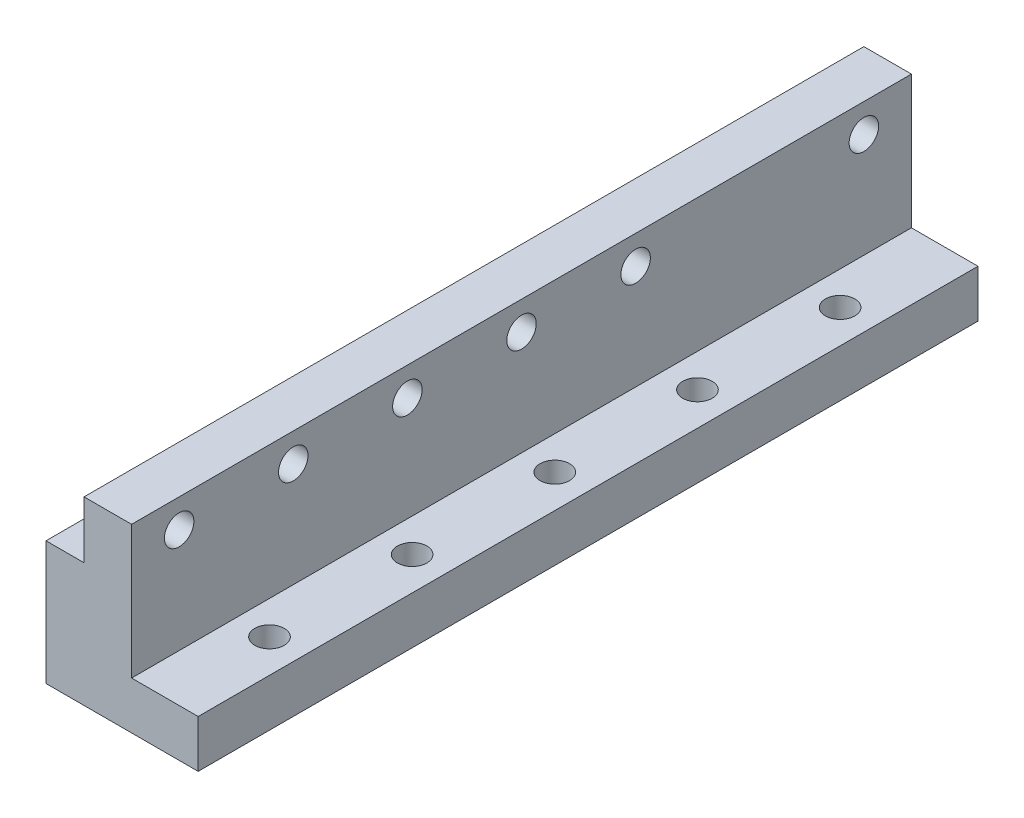
ISO-10303-21;
HEADER;
FILE_DESCRIPTION(('STEP AP214'),'2;1');
FILE_NAME('part.step','',(''),(''),'','','');
FILE_SCHEMA(('AUTOMOTIVE_DESIGN { 1 0 10303 214 1 1 1 1 }'));
ENDSEC;
DATA;
#1=APPLICATION_CONTEXT('core data for automotive mechanical design processes');
#2=APPLICATION_PROTOCOL_DEFINITION('international standard','automotive_design',2000,#1);
#3=PRODUCT_CONTEXT('',#1,'mechanical');
#4=PRODUCT('Part','Part','',(#3));
#5=PRODUCT_RELATED_PRODUCT_CATEGORY('part','',(#4));
#6=PRODUCT_DEFINITION_FORMATION('','',#4);
#7=PRODUCT_DEFINITION_CONTEXT('part definition',#1,'design');
#8=PRODUCT_DEFINITION('design','',#6,#7);
#9=PRODUCT_DEFINITION_SHAPE('','',#8);
#10=(LENGTH_UNIT() NAMED_UNIT(*) SI_UNIT(.MILLI.,.METRE.));
#11=(NAMED_UNIT(*) PLANE_ANGLE_UNIT() SI_UNIT($,.RADIAN.));
#12=(NAMED_UNIT(*) SI_UNIT($,.STERADIAN.) SOLID_ANGLE_UNIT());
#13=UNCERTAINTY_MEASURE_WITH_UNIT(LENGTH_MEASURE(1.E-05),#10,'distance_accuracy_value','');
#14=(GEOMETRIC_REPRESENTATION_CONTEXT(3) GLOBAL_UNCERTAINTY_ASSIGNED_CONTEXT((#13)) GLOBAL_UNIT_ASSIGNED_CONTEXT((#10,
#11,#12)) REPRESENTATION_CONTEXT('',''));
#15=CARTESIAN_POINT('',(0.,0.,0.));
#16=DIRECTION('',(0.,0.,1.));
#17=DIRECTION('',(1.,0.,0.));
#18=AXIS2_PLACEMENT_3D('',#15,#16,#17);
#19=CARTESIAN_POINT('',(12.5,-13.,11.));
#20=DIRECTION('',(0.,1.,0.));
#21=DIRECTION('',(0.,0.,1.));
#22=AXIS2_PLACEMENT_3D('',#19,#20,#21);
#23=CYLINDRICAL_SURFACE('',#22,1.54999999999999);
#24=CARTESIAN_POINT('',(12.5,-13.,11.));
#25=DIRECTION('',(0.,1.,0.));
#26=DIRECTION('',(0.,0.,-1.));
#27=AXIS2_PLACEMENT_3D('',#24,#25,#26);
#28=CIRCLE('',#27,1.54999999999999);
#29=CARTESIAN_POINT('',(12.5,-13.,9.45000000000002));
#30=VERTEX_POINT('',#29);
#31=EDGE_CURVE('E44',#30,#30,#28,.T.);
#32=ORIENTED_EDGE('',*,*,#31,.F.);
#33=EDGE_LOOP('',(#32));
#34=FACE_BOUND('',#33,.T.);
#35=CARTESIAN_POINT('',(12.5,-8.,11.));
#36=DIRECTION('',(0.,1.,0.));
#37=DIRECTION('',(0.,0.,-1.));
#38=AXIS2_PLACEMENT_3D('',#35,#36,#37);
#39=CIRCLE('',#38,1.54999999999999);
#40=CARTESIAN_POINT('',(12.5,-8.,9.45000000000002));
#41=VERTEX_POINT('',#40);
#42=EDGE_CURVE('E11',#41,#41,#39,.T.);
#43=ORIENTED_EDGE('',*,*,#42,.T.);
#44=EDGE_LOOP('',(#43));
#45=FACE_BOUND('',#44,.T.);
#46=ADVANCED_FACE('F36',(#34,#45),#23,.F.);
#47=CARTESIAN_POINT('',(12.5,-13.,26.));
#48=DIRECTION('',(0.,1.,0.));
#49=DIRECTION('',(0.,0.,1.));
#50=AXIS2_PLACEMENT_3D('',#47,#48,#49);
#51=CYLINDRICAL_SURFACE('',#50,1.54999999999999);
#52=CARTESIAN_POINT('',(12.5,-13.,26.));
#53=DIRECTION('',(0.,1.,0.));
#54=DIRECTION('',(0.,0.,-1.));
#55=AXIS2_PLACEMENT_3D('',#52,#53,#54);
#56=CIRCLE('',#55,1.54999999999999);
#57=CARTESIAN_POINT('',(12.5,-13.,24.45));
#58=VERTEX_POINT('',#57);
#59=EDGE_CURVE('E190',#58,#58,#56,.T.);
#60=ORIENTED_EDGE('',*,*,#59,.F.);
#61=EDGE_LOOP('',(#60));
#62=FACE_BOUND('',#61,.T.);
#63=CARTESIAN_POINT('',(12.5,-8.,26.));
#64=DIRECTION('',(0.,1.,0.));
#65=DIRECTION('',(0.,0.,-1.));
#66=AXIS2_PLACEMENT_3D('',#63,#64,#65);
#67=CIRCLE('',#66,1.54999999999999);
#68=CARTESIAN_POINT('',(12.5,-8.,24.45));
#69=VERTEX_POINT('',#68);
#70=EDGE_CURVE('E193',#69,#69,#67,.T.);
#71=ORIENTED_EDGE('',*,*,#70,.T.);
#72=EDGE_LOOP('',(#71));
#73=FACE_BOUND('',#72,.T.);
#74=ADVANCED_FACE('F202',(#62,#73),#51,.F.);
#75=CARTESIAN_POINT('',(12.5,-13.,41.));
#76=DIRECTION('',(0.,1.,0.));
#77=DIRECTION('',(0.,0.,1.));
#78=AXIS2_PLACEMENT_3D('',#75,#76,#77);
#79=CYLINDRICAL_SURFACE('',#78,1.54999999999999);
#80=CARTESIAN_POINT('',(12.5,-13.,41.));
#81=DIRECTION('',(0.,1.,0.));
#82=DIRECTION('',(0.,0.,-1.));
#83=AXIS2_PLACEMENT_3D('',#80,#81,#82);
#84=CIRCLE('',#83,1.54999999999999);
#85=CARTESIAN_POINT('',(12.5,-13.,39.45));
#86=VERTEX_POINT('',#85);
#87=EDGE_CURVE('E164',#86,#86,#84,.T.);
#88=ORIENTED_EDGE('',*,*,#87,.F.);
#89=EDGE_LOOP('',(#88));
#90=FACE_BOUND('',#89,.T.);
#91=CARTESIAN_POINT('',(12.5,-8.,41.));
#92=DIRECTION('',(0.,1.,0.));
#93=DIRECTION('',(0.,0.,-1.));
#94=AXIS2_PLACEMENT_3D('',#91,#92,#93);
#95=CIRCLE('',#94,1.54999999999999);
#96=CARTESIAN_POINT('',(12.5,-8.,39.45));
#97=VERTEX_POINT('',#96);
#98=EDGE_CURVE('E187',#97,#97,#95,.T.);
#99=ORIENTED_EDGE('',*,*,#98,.T.);
#100=EDGE_LOOP('',(#99));
#101=FACE_BOUND('',#100,.T.);
#102=ADVANCED_FACE('F238',(#90,#101),#79,.F.);
#103=CARTESIAN_POINT('',(9.,6.,82.));
#104=DIRECTION('',(0.,-1.,0.));
#105=DIRECTION('',(1.,0.,0.));
#106=AXIS2_PLACEMENT_3D('',#103,#104,#105);
#107=PLANE('',#106);
#108=DIRECTION('',(-1.,0.,0.));
#109=VECTOR('',#108,1.);
#110=CARTESIAN_POINT('',(9.,6.,0.));
#111=LINE('',#110,#109);
#112=CARTESIAN_POINT('',(9.,6.,0.));
#113=VERTEX_POINT('',#112);
#114=CARTESIAN_POINT('',(4.,6.,0.));
#115=VERTEX_POINT('',#114);
#116=EDGE_CURVE('E134',#113,#115,#111,.T.);
#117=ORIENTED_EDGE('',*,*,#116,.T.);
#118=DIRECTION('',(0.,0.,-1.));
#119=VECTOR('',#118,1.);
#120=CARTESIAN_POINT('',(4.,6.,82.));
#121=LINE('',#120,#119);
#122=CARTESIAN_POINT('',(4.,6.,82.));
#123=VERTEX_POINT('',#122);
#124=EDGE_CURVE('E162',#123,#115,#121,.T.);
#125=ORIENTED_EDGE('',*,*,#124,.F.);
#126=DIRECTION('',(-1.,0.,0.));
#127=VECTOR('',#126,1.);
#128=CARTESIAN_POINT('',(9.,6.,82.));
#129=LINE('',#128,#127);
#130=CARTESIAN_POINT('',(9.,6.,82.));
#131=VERTEX_POINT('',#130);
#132=EDGE_CURVE('E149',#131,#123,#129,.T.);
#133=ORIENTED_EDGE('',*,*,#132,.F.);
#134=DIRECTION('',(0.,0.,-1.));
#135=VECTOR('',#134,1.);
#136=CARTESIAN_POINT('',(9.,6.,82.));
#137=LINE('',#136,#135);
#138=EDGE_CURVE('E130',#131,#113,#137,.T.);
#139=ORIENTED_EDGE('',*,*,#138,.T.);
#140=EDGE_LOOP('',(#117,#125,#133,#139));
#141=FACE_BOUND('',#140,.T.);
#142=ADVANCED_FACE('F234',(#141),#107,.F.);
#143=CARTESIAN_POINT('',(4.,6.,82.));
#144=DIRECTION('',(1.,0.,0.));
#145=DIRECTION('',(0.,1.,0.));
#146=AXIS2_PLACEMENT_3D('',#143,#144,#145);
#147=PLANE('',#146);
#148=CARTESIAN_POINT('',(4.,3.,5.));
#149=DIRECTION('',(-1.,0.,0.));
#150=DIRECTION('',(0.,-1.,0.));
#151=AXIS2_PLACEMENT_3D('',#148,#149,#150);
#152=CIRCLE('',#151,1.55);
#153=CARTESIAN_POINT('',(4.,1.45,5.));
#154=VERTEX_POINT('',#153);
#155=EDGE_CURVE('E169',#154,#154,#152,.T.);
#156=ORIENTED_EDGE('',*,*,#155,.F.);
#157=EDGE_LOOP('',(#156));
#158=FACE_BOUND('',#157,.T.);
#159=CARTESIAN_POINT('',(4.,3.,29.));
#160=DIRECTION('',(-1.,0.,0.));
#161=DIRECTION('',(0.,-1.,0.));
#162=AXIS2_PLACEMENT_3D('',#159,#160,#161);
#163=CIRCLE('',#162,1.55);
#164=CARTESIAN_POINT('',(4.,1.45,29.));
#165=VERTEX_POINT('',#164);
#166=EDGE_CURVE('E415',#165,#165,#163,.T.);
#167=ORIENTED_EDGE('',*,*,#166,.F.);
#168=EDGE_LOOP('',(#167));
#169=FACE_BOUND('',#168,.T.);
#170=CARTESIAN_POINT('',(4.,3.,41.));
#171=DIRECTION('',(-1.,0.,0.));
#172=DIRECTION('',(0.,-1.,0.));
#173=AXIS2_PLACEMENT_3D('',#170,#171,#172);
#174=CIRCLE('',#173,1.55);
#175=CARTESIAN_POINT('',(4.,1.45,41.));
#176=VERTEX_POINT('',#175);
#177=EDGE_CURVE('E418',#176,#176,#174,.T.);
#178=ORIENTED_EDGE('',*,*,#177,.F.);
#179=EDGE_LOOP('',(#178));
#180=FACE_BOUND('',#179,.T.);
#181=CARTESIAN_POINT('',(4.,3.,53.));
#182=DIRECTION('',(-1.,0.,0.));
#183=DIRECTION('',(0.,-1.,0.));
#184=AXIS2_PLACEMENT_3D('',#181,#182,#183);
#185=CIRCLE('',#184,1.55);
#186=CARTESIAN_POINT('',(4.,1.45,53.));
#187=VERTEX_POINT('',#186);
#188=EDGE_CURVE('E421',#187,#187,#185,.T.);
#189=ORIENTED_EDGE('',*,*,#188,.F.);
#190=EDGE_LOOP('',(#189));
#191=FACE_BOUND('',#190,.T.);
#192=CARTESIAN_POINT('',(4.,3.,65.));
#193=DIRECTION('',(-1.,0.,0.));
#194=DIRECTION('',(0.,-1.,0.));
#195=AXIS2_PLACEMENT_3D('',#192,#193,#194);
#196=CIRCLE('',#195,1.54999999999999);
#197=CARTESIAN_POINT('',(4.,1.45000000000001,65.));
#198=VERTEX_POINT('',#197);
#199=EDGE_CURVE('E409',#198,#198,#196,.T.);
#200=ORIENTED_EDGE('',*,*,#199,.F.);
#201=EDGE_LOOP('',(#200));
#202=FACE_BOUND('',#201,.T.);
#203=CARTESIAN_POINT('',(4.,3.,77.));
#204=DIRECTION('',(-1.,0.,0.));
#205=DIRECTION('',(0.,-1.,0.));
#206=AXIS2_PLACEMENT_3D('',#203,#204,#205);
#207=CIRCLE('',#206,1.54999999999999);
#208=CARTESIAN_POINT('',(4.,1.45000000000001,77.));
#209=VERTEX_POINT('',#208);
#210=EDGE_CURVE('E406',#209,#209,#207,.T.);
#211=ORIENTED_EDGE('',*,*,#210,.F.);
#212=EDGE_LOOP('',(#211));
#213=FACE_BOUND('',#212,.T.);
#214=DIRECTION('',(0.,-1.,0.));
#215=VECTOR('',#214,1.);
#216=CARTESIAN_POINT('',(4.,6.,0.));
#217=LINE('',#216,#215);
#218=CARTESIAN_POINT('',(4.,0.,0.));
#219=VERTEX_POINT('',#218);
#220=EDGE_CURVE('E137',#115,#219,#217,.T.);
#221=ORIENTED_EDGE('',*,*,#220,.T.);
#222=DIRECTION('',(0.,0.,-1.));
#223=VECTOR('',#222,1.);
#224=CARTESIAN_POINT('',(4.,0.,82.));
#225=LINE('',#224,#223);
#226=CARTESIAN_POINT('',(4.,0.,82.));
#227=VERTEX_POINT('',#226);
#228=EDGE_CURVE('E159',#227,#219,#225,.T.);
#229=ORIENTED_EDGE('',*,*,#228,.F.);
#230=DIRECTION('',(0.,-1.,0.));
#231=VECTOR('',#230,1.);
#232=CARTESIAN_POINT('',(4.,6.,82.));
#233=LINE('',#232,#231);
#234=EDGE_CURVE('E96',#123,#227,#233,.T.);
#235=ORIENTED_EDGE('',*,*,#234,.F.);
#236=ORIENTED_EDGE('',*,*,#124,.T.);
#237=EDGE_LOOP('',(#221,#229,#235,#236));
#238=FACE_BOUND('',#237,.T.);
#239=ADVANCED_FACE('F230',(#158,#169,#180,#191,#202,#213,#238),#147,.F.);
#240=CARTESIAN_POINT('',(4.,0.,82.));
#241=DIRECTION('',(0.,-1.,0.));
#242=DIRECTION('',(1.,0.,0.));
#243=AXIS2_PLACEMENT_3D('',#240,#241,#242);
#244=PLANE('',#243);
#245=DIRECTION('',(-1.,0.,0.));
#246=VECTOR('',#245,1.);
#247=CARTESIAN_POINT('',(4.,0.,0.));
#248=LINE('',#247,#246);
#249=CARTESIAN_POINT('',(0.,0.,0.));
#250=VERTEX_POINT('',#249);
#251=EDGE_CURVE('E140',#219,#250,#248,.T.);
#252=ORIENTED_EDGE('',*,*,#251,.T.);
#253=DIRECTION('',(0.,0.,-1.));
#254=VECTOR('',#253,1.);
#255=CARTESIAN_POINT('',(0.,0.,82.));
#256=LINE('',#255,#254);
#257=CARTESIAN_POINT('',(0.,0.,82.));
#258=VERTEX_POINT('',#257);
#259=EDGE_CURVE('E156',#258,#250,#256,.T.);
#260=ORIENTED_EDGE('',*,*,#259,.F.);
#261=DIRECTION('',(-1.,0.,0.));
#262=VECTOR('',#261,1.);
#263=CARTESIAN_POINT('',(4.,0.,82.));
#264=LINE('',#263,#262);
#265=EDGE_CURVE('E432',#227,#258,#264,.T.);
#266=ORIENTED_EDGE('',*,*,#265,.F.);
#267=ORIENTED_EDGE('',*,*,#228,.T.);
#268=EDGE_LOOP('',(#252,#260,#266,#267));
#269=FACE_BOUND('',#268,.T.);
#270=ADVANCED_FACE('F226',(#269),#244,.F.);
#271=CARTESIAN_POINT('',(0.,0.,82.));
#272=DIRECTION('',(1.,0.,0.));
#273=DIRECTION('',(0.,1.,0.));
#274=AXIS2_PLACEMENT_3D('',#271,#272,#273);
#275=PLANE('',#274);
#276=DIRECTION('',(0.,-1.,0.));
#277=VECTOR('',#276,1.);
#278=CARTESIAN_POINT('',(0.,0.,0.));
#279=LINE('',#278,#277);
#280=CARTESIAN_POINT('',(0.,-13.,0.));
#281=VERTEX_POINT('',#280);
#282=EDGE_CURVE('E142',#250,#281,#279,.T.);
#283=ORIENTED_EDGE('',*,*,#282,.T.);
#284=DIRECTION('',(0.,0.,-1.));
#285=VECTOR('',#284,1.);
#286=CARTESIAN_POINT('',(0.,-13.,82.));
#287=LINE('',#286,#285);
#288=CARTESIAN_POINT('',(0.,-13.,82.));
#289=VERTEX_POINT('',#288);
#290=EDGE_CURVE('E153',#289,#281,#287,.T.);
#291=ORIENTED_EDGE('',*,*,#290,.F.);
#292=DIRECTION('',(0.,-1.,0.));
#293=VECTOR('',#292,1.);
#294=CARTESIAN_POINT('',(0.,0.,82.));
#295=LINE('',#294,#293);
#296=EDGE_CURVE('E434',#258,#289,#295,.T.);
#297=ORIENTED_EDGE('',*,*,#296,.F.);
#298=ORIENTED_EDGE('',*,*,#259,.T.);
#299=EDGE_LOOP('',(#283,#291,#297,#298));
#300=FACE_BOUND('',#299,.T.);
#301=ADVANCED_FACE('F222',(#300),#275,.F.);
#302=CARTESIAN_POINT('',(0.,-13.,82.));
#303=DIRECTION('',(0.,1.,0.));
#304=DIRECTION('',(0.,0.,1.));
#305=AXIS2_PLACEMENT_3D('',#302,#303,#304);
#306=PLANE('',#305);
#307=CARTESIAN_POINT('',(12.5,-13.,56.));
#308=DIRECTION('',(0.,1.,0.));
#309=DIRECTION('',(0.,0.,-1.));
#310=AXIS2_PLACEMENT_3D('',#307,#308,#309);
#311=CIRCLE('',#310,1.54999999999999);
#312=CARTESIAN_POINT('',(12.5,-13.,54.45));
#313=VERTEX_POINT('',#312);
#314=EDGE_CURVE('E403',#313,#313,#311,.T.);
#315=ORIENTED_EDGE('',*,*,#314,.T.);
#316=EDGE_LOOP('',(#315));
#317=FACE_BOUND('',#316,.T.);
#318=CARTESIAN_POINT('',(12.5,-13.,71.));
#319=DIRECTION('',(0.,1.,0.));
#320=DIRECTION('',(0.,0.,-1.));
#321=AXIS2_PLACEMENT_3D('',#318,#319,#320);
#322=CIRCLE('',#321,1.54999999999999);
#323=CARTESIAN_POINT('',(12.5,-13.,69.45));
#324=VERTEX_POINT('',#323);
#325=EDGE_CURVE('E138',#324,#324,#322,.T.);
#326=ORIENTED_EDGE('',*,*,#325,.T.);
#327=EDGE_LOOP('',(#326));
#328=FACE_BOUND('',#327,.T.);
#329=DIRECTION('',(1.,0.,0.));
#330=VECTOR('',#329,1.);
#331=CARTESIAN_POINT('',(0.,-13.,0.));
#332=LINE('',#331,#330);
#333=CARTESIAN_POINT('',(16.,-13.,0.));
#334=VERTEX_POINT('',#333);
#335=EDGE_CURVE('E144',#281,#334,#332,.T.);
#336=ORIENTED_EDGE('',*,*,#335,.T.);
#337=DIRECTION('',(0.,0.,-1.));
#338=VECTOR('',#337,1.);
#339=CARTESIAN_POINT('',(16.,-13.,82.));
#340=LINE('',#339,#338);
#341=CARTESIAN_POINT('',(16.,-13.,82.));
#342=VERTEX_POINT('',#341);
#343=EDGE_CURVE('E124',#342,#334,#340,.T.);
#344=ORIENTED_EDGE('',*,*,#343,.F.);
#345=DIRECTION('',(1.,0.,0.));
#346=VECTOR('',#345,1.);
#347=CARTESIAN_POINT('',(0.,-13.,82.));
#348=LINE('',#347,#346);
#349=EDGE_CURVE('E115',#289,#342,#348,.T.);
#350=ORIENTED_EDGE('',*,*,#349,.F.);
#351=ORIENTED_EDGE('',*,*,#290,.T.);
#352=EDGE_LOOP('',(#336,#344,#350,#351));
#353=FACE_BOUND('',#352,.T.);
#354=ORIENTED_EDGE('',*,*,#87,.T.);
#355=EDGE_LOOP('',(#354));
#356=FACE_BOUND('',#355,.T.);
#357=ORIENTED_EDGE('',*,*,#59,.T.);
#358=EDGE_LOOP('',(#357));
#359=FACE_BOUND('',#358,.T.);
#360=ORIENTED_EDGE('',*,*,#31,.T.);
#361=EDGE_LOOP('',(#360));
#362=FACE_BOUND('',#361,.T.);
#363=ADVANCED_FACE('F198',(#317,#328,#353,#356,#359,#362),#306,.F.);
#364=CARTESIAN_POINT('',(16.,-13.,82.));
#365=DIRECTION('',(-1.,0.,0.));
#366=DIRECTION('',(0.,0.,1.));
#367=AXIS2_PLACEMENT_3D('',#364,#365,#366);
#368=PLANE('',#367);
#369=DIRECTION('',(0.,1.,0.));
#370=VECTOR('',#369,1.);
#371=CARTESIAN_POINT('',(16.,-13.,0.));
#372=LINE('',#371,#370);
#373=CARTESIAN_POINT('',(16.,-8.,0.));
#374=VERTEX_POINT('',#373);
#375=EDGE_CURVE('E123',#334,#374,#372,.T.);
#376=ORIENTED_EDGE('',*,*,#375,.T.);
#377=DIRECTION('',(0.,0.,-1.));
#378=VECTOR('',#377,1.);
#379=CARTESIAN_POINT('',(16.,-8.,82.));
#380=LINE('',#379,#378);
#381=CARTESIAN_POINT('',(16.,-8.,82.));
#382=VERTEX_POINT('',#381);
#383=EDGE_CURVE('E120',#382,#374,#380,.T.);
#384=ORIENTED_EDGE('',*,*,#383,.F.);
#385=DIRECTION('',(0.,1.,0.));
#386=VECTOR('',#385,1.);
#387=CARTESIAN_POINT('',(16.,-13.,82.));
#388=LINE('',#387,#386);
#389=EDGE_CURVE('E109',#342,#382,#388,.T.);
#390=ORIENTED_EDGE('',*,*,#389,.F.);
#391=ORIENTED_EDGE('',*,*,#343,.T.);
#392=EDGE_LOOP('',(#376,#384,#390,#391));
#393=FACE_BOUND('',#392,.T.);
#394=ADVANCED_FACE('F121',(#393),#368,.F.);
#395=CARTESIAN_POINT('',(16.,-8.,82.));
#396=DIRECTION('',(0.,-1.,0.));
#397=DIRECTION('',(1.,0.,0.));
#398=AXIS2_PLACEMENT_3D('',#395,#396,#397);
#399=PLANE('',#398);
#400=CARTESIAN_POINT('',(12.5,-8.,56.));
#401=DIRECTION('',(0.,1.,0.));
#402=DIRECTION('',(0.,0.,-1.));
#403=AXIS2_PLACEMENT_3D('',#400,#401,#402);
#404=CIRCLE('',#403,1.54999999999999);
#405=CARTESIAN_POINT('',(12.5,-8.,54.45));
#406=VERTEX_POINT('',#405);
#407=EDGE_CURVE('E405',#406,#406,#404,.T.);
#408=ORIENTED_EDGE('',*,*,#407,.F.);
#409=EDGE_LOOP('',(#408));
#410=FACE_BOUND('',#409,.T.);
#411=CARTESIAN_POINT('',(12.5,-8.,71.));
#412=DIRECTION('',(0.,1.,0.));
#413=DIRECTION('',(0.,0.,-1.));
#414=AXIS2_PLACEMENT_3D('',#411,#412,#413);
#415=CIRCLE('',#414,1.54999999999999);
#416=CARTESIAN_POINT('',(12.5,-8.,69.45));
#417=VERTEX_POINT('',#416);
#418=EDGE_CURVE('E184',#417,#417,#415,.T.);
#419=ORIENTED_EDGE('',*,*,#418,.F.);
#420=EDGE_LOOP('',(#419));
#421=FACE_BOUND('',#420,.T.);
#422=DIRECTION('',(-1.,0.,0.));
#423=VECTOR('',#422,1.);
#424=CARTESIAN_POINT('',(16.,-8.,0.));
#425=LINE('',#424,#423);
#426=CARTESIAN_POINT('',(9.,-8.,0.));
#427=VERTEX_POINT('',#426);
#428=EDGE_CURVE('E81',#374,#427,#425,.T.);
#429=ORIENTED_EDGE('',*,*,#428,.T.);
#430=DIRECTION('',(0.,0.,-1.));
#431=VECTOR('',#430,1.);
#432=CARTESIAN_POINT('',(9.,-8.,82.));
#433=LINE('',#432,#431);
#434=CARTESIAN_POINT('',(9.,-8.,82.));
#435=VERTEX_POINT('',#434);
#436=EDGE_CURVE('E125',#435,#427,#433,.T.);
#437=ORIENTED_EDGE('',*,*,#436,.F.);
#438=DIRECTION('',(-1.,0.,0.));
#439=VECTOR('',#438,1.);
#440=CARTESIAN_POINT('',(16.,-8.,82.));
#441=LINE('',#440,#439);
#442=EDGE_CURVE('E113',#382,#435,#441,.T.);
#443=ORIENTED_EDGE('',*,*,#442,.F.);
#444=ORIENTED_EDGE('',*,*,#383,.T.);
#445=EDGE_LOOP('',(#429,#437,#443,#444));
#446=FACE_BOUND('',#445,.T.);
#447=ORIENTED_EDGE('',*,*,#98,.F.);
#448=EDGE_LOOP('',(#447));
#449=FACE_BOUND('',#448,.T.);
#450=ORIENTED_EDGE('',*,*,#70,.F.);
#451=EDGE_LOOP('',(#450));
#452=FACE_BOUND('',#451,.T.);
#453=ORIENTED_EDGE('',*,*,#42,.F.);
#454=EDGE_LOOP('',(#453));
#455=FACE_BOUND('',#454,.T.);
#456=ADVANCED_FACE('F127',(#410,#421,#446,#449,#452,#455),#399,.F.);
#457=CARTESIAN_POINT('',(9.,-8.,82.));
#458=DIRECTION('',(-1.,0.,0.));
#459=DIRECTION('',(0.,0.,1.));
#460=AXIS2_PLACEMENT_3D('',#457,#458,#459);
#461=PLANE('',#460);
#462=CARTESIAN_POINT('',(9.,3.,5.));
#463=DIRECTION('',(-1.,0.,0.));
#464=DIRECTION('',(0.,0.,1.));
#465=AXIS2_PLACEMENT_3D('',#462,#463,#464);
#466=CIRCLE('',#465,1.55);
#467=CARTESIAN_POINT('',(9.,3.,6.55));
#468=VERTEX_POINT('',#467);
#469=EDGE_CURVE('E181',#468,#468,#466,.T.);
#470=ORIENTED_EDGE('',*,*,#469,.T.);
#471=EDGE_LOOP('',(#470));
#472=FACE_BOUND('',#471,.T.);
#473=CARTESIAN_POINT('',(9.,3.,29.));
#474=DIRECTION('',(-1.,0.,0.));
#475=DIRECTION('',(0.,0.,1.));
#476=AXIS2_PLACEMENT_3D('',#473,#474,#475);
#477=CIRCLE('',#476,1.55);
#478=CARTESIAN_POINT('',(9.,3.,30.55));
#479=VERTEX_POINT('',#478);
#480=EDGE_CURVE('E178',#479,#479,#477,.T.);
#481=ORIENTED_EDGE('',*,*,#480,.T.);
#482=EDGE_LOOP('',(#481));
#483=FACE_BOUND('',#482,.T.);
#484=CARTESIAN_POINT('',(9.,3.,41.));
#485=DIRECTION('',(-1.,0.,0.));
#486=DIRECTION('',(0.,0.,1.));
#487=AXIS2_PLACEMENT_3D('',#484,#485,#486);
#488=CIRCLE('',#487,1.55);
#489=CARTESIAN_POINT('',(9.,3.,42.55));
#490=VERTEX_POINT('',#489);
#491=EDGE_CURVE('E175',#490,#490,#488,.T.);
#492=ORIENTED_EDGE('',*,*,#491,.T.);
#493=EDGE_LOOP('',(#492));
#494=FACE_BOUND('',#493,.T.);
#495=CARTESIAN_POINT('',(9.,3.,53.));
#496=DIRECTION('',(-1.,0.,0.));
#497=DIRECTION('',(0.,0.,1.));
#498=AXIS2_PLACEMENT_3D('',#495,#496,#497);
#499=CIRCLE('',#498,1.55);
#500=CARTESIAN_POINT('',(9.,3.,54.55));
#501=VERTEX_POINT('',#500);
#502=EDGE_CURVE('E172',#501,#501,#499,.T.);
#503=ORIENTED_EDGE('',*,*,#502,.T.);
#504=EDGE_LOOP('',(#503));
#505=FACE_BOUND('',#504,.T.);
#506=CARTESIAN_POINT('',(9.,3.,65.));
#507=DIRECTION('',(-1.,0.,0.));
#508=DIRECTION('',(0.,0.,1.));
#509=AXIS2_PLACEMENT_3D('',#506,#507,#508);
#510=CIRCLE('',#509,1.54999999999999);
#511=CARTESIAN_POINT('',(9.,3.,66.55));
#512=VERTEX_POINT('',#511);
#513=EDGE_CURVE('E168',#512,#512,#510,.T.);
#514=ORIENTED_EDGE('',*,*,#513,.T.);
#515=EDGE_LOOP('',(#514));
#516=FACE_BOUND('',#515,.T.);
#517=CARTESIAN_POINT('',(9.,3.,77.));
#518=DIRECTION('',(-1.,0.,0.));
#519=DIRECTION('',(0.,0.,1.));
#520=AXIS2_PLACEMENT_3D('',#517,#518,#519);
#521=CIRCLE('',#520,1.54999999999999);
#522=CARTESIAN_POINT('',(9.,3.,78.55));
#523=VERTEX_POINT('',#522);
#524=EDGE_CURVE('E165',#523,#523,#521,.T.);
#525=ORIENTED_EDGE('',*,*,#524,.T.);
#526=EDGE_LOOP('',(#525));
#527=FACE_BOUND('',#526,.T.);
#528=DIRECTION('',(0.,1.,0.));
#529=VECTOR('',#528,1.);
#530=CARTESIAN_POINT('',(9.,-8.,0.));
#531=LINE('',#530,#529);
#532=EDGE_CURVE('E87',#427,#113,#531,.T.);
#533=ORIENTED_EDGE('',*,*,#532,.T.);
#534=ORIENTED_EDGE('',*,*,#138,.F.);
#535=DIRECTION('',(0.,1.,0.));
#536=VECTOR('',#535,1.);
#537=CARTESIAN_POINT('',(9.,-8.,82.));
#538=LINE('',#537,#536);
#539=EDGE_CURVE('E52',#435,#131,#538,.T.);
#540=ORIENTED_EDGE('',*,*,#539,.F.);
#541=ORIENTED_EDGE('',*,*,#436,.T.);
#542=EDGE_LOOP('',(#533,#534,#540,#541));
#543=FACE_BOUND('',#542,.T.);
#544=ADVANCED_FACE('F206',(#472,#483,#494,#505,#516,#527,#543),#461,.F.);
#545=CARTESIAN_POINT('',(0.,0.,82.));
#546=DIRECTION('',(0.,0.,1.));
#547=DIRECTION('',(1.,0.,0.));
#548=AXIS2_PLACEMENT_3D('',#545,#546,#547);
#549=PLANE('',#548);
#550=ORIENTED_EDGE('',*,*,#132,.T.);
#551=ORIENTED_EDGE('',*,*,#234,.T.);
#552=ORIENTED_EDGE('',*,*,#265,.T.);
#553=ORIENTED_EDGE('',*,*,#296,.T.);
#554=ORIENTED_EDGE('',*,*,#349,.T.);
#555=ORIENTED_EDGE('',*,*,#389,.T.);
#556=ORIENTED_EDGE('',*,*,#442,.T.);
#557=ORIENTED_EDGE('',*,*,#539,.T.);
#558=EDGE_LOOP('',(#550,#551,#552,#553,#554,#555,#556,#557));
#559=FACE_BOUND('',#558,.T.);
#560=ADVANCED_FACE('F111',(#559),#549,.T.);
#561=CARTESIAN_POINT('',(0.,0.,0.));
#562=DIRECTION('',(0.,0.,1.));
#563=DIRECTION('',(1.,0.,0.));
#564=AXIS2_PLACEMENT_3D('',#561,#562,#563);
#565=PLANE('',#564);
#566=ORIENTED_EDGE('',*,*,#116,.F.);
#567=ORIENTED_EDGE('',*,*,#532,.F.);
#568=ORIENTED_EDGE('',*,*,#428,.F.);
#569=ORIENTED_EDGE('',*,*,#375,.F.);
#570=ORIENTED_EDGE('',*,*,#335,.F.);
#571=ORIENTED_EDGE('',*,*,#282,.F.);
#572=ORIENTED_EDGE('',*,*,#251,.F.);
#573=ORIENTED_EDGE('',*,*,#220,.F.);
#574=EDGE_LOOP('',(#566,#567,#568,#569,#570,#571,#572,#573));
#575=FACE_BOUND('',#574,.T.);
#576=ADVANCED_FACE('F293',(#575),#565,.F.);
#577=CARTESIAN_POINT('',(12.5,-13.,71.));
#578=DIRECTION('',(0.,1.,0.));
#579=DIRECTION('',(0.,0.,1.));
#580=AXIS2_PLACEMENT_3D('',#577,#578,#579);
#581=CYLINDRICAL_SURFACE('',#580,1.54999999999999);
#582=ORIENTED_EDGE('',*,*,#325,.F.);
#583=EDGE_LOOP('',(#582));
#584=FACE_BOUND('',#583,.T.);
#585=ORIENTED_EDGE('',*,*,#418,.T.);
#586=EDGE_LOOP('',(#585));
#587=FACE_BOUND('',#586,.T.);
#588=ADVANCED_FACE('F302',(#584,#587),#581,.F.);
#589=CARTESIAN_POINT('',(16.,3.,77.));
#590=DIRECTION('',(-1.,0.,0.));
#591=DIRECTION('',(0.,-1.,0.));
#592=AXIS2_PLACEMENT_3D('',#589,#590,#591);
#593=CYLINDRICAL_SURFACE('',#592,1.54999999999999);
#594=ORIENTED_EDGE('',*,*,#210,.T.);
#595=EDGE_LOOP('',(#594));
#596=FACE_BOUND('',#595,.T.);
#597=ORIENTED_EDGE('',*,*,#524,.F.);
#598=EDGE_LOOP('',(#597));
#599=FACE_BOUND('',#598,.T.);
#600=ADVANCED_FACE('F310',(#596,#599),#593,.F.);
#601=CARTESIAN_POINT('',(16.,3.,65.));
#602=DIRECTION('',(-1.,0.,0.));
#603=DIRECTION('',(0.,-1.,0.));
#604=AXIS2_PLACEMENT_3D('',#601,#602,#603);
#605=CYLINDRICAL_SURFACE('',#604,1.54999999999999);
#606=ORIENTED_EDGE('',*,*,#199,.T.);
#607=EDGE_LOOP('',(#606));
#608=FACE_BOUND('',#607,.T.);
#609=ORIENTED_EDGE('',*,*,#513,.F.);
#610=EDGE_LOOP('',(#609));
#611=FACE_BOUND('',#610,.T.);
#612=ADVANCED_FACE('F321',(#608,#611),#605,.F.);
#613=CARTESIAN_POINT('',(16.,3.,53.));
#614=DIRECTION('',(-1.,0.,0.));
#615=DIRECTION('',(0.,-1.,0.));
#616=AXIS2_PLACEMENT_3D('',#613,#614,#615);
#617=CYLINDRICAL_SURFACE('',#616,1.55);
#618=ORIENTED_EDGE('',*,*,#188,.T.);
#619=EDGE_LOOP('',(#618));
#620=FACE_BOUND('',#619,.T.);
#621=ORIENTED_EDGE('',*,*,#502,.F.);
#622=EDGE_LOOP('',(#621));
#623=FACE_BOUND('',#622,.T.);
#624=ADVANCED_FACE('F328',(#620,#623),#617,.F.);
#625=CARTESIAN_POINT('',(16.,3.,41.));
#626=DIRECTION('',(-1.,0.,0.));
#627=DIRECTION('',(0.,-1.,0.));
#628=AXIS2_PLACEMENT_3D('',#625,#626,#627);
#629=CYLINDRICAL_SURFACE('',#628,1.55);
#630=ORIENTED_EDGE('',*,*,#177,.T.);
#631=EDGE_LOOP('',(#630));
#632=FACE_BOUND('',#631,.T.);
#633=ORIENTED_EDGE('',*,*,#491,.F.);
#634=EDGE_LOOP('',(#633));
#635=FACE_BOUND('',#634,.T.);
#636=ADVANCED_FACE('F336',(#632,#635),#629,.F.);
#637=CARTESIAN_POINT('',(16.,3.,29.));
#638=DIRECTION('',(-1.,0.,0.));
#639=DIRECTION('',(0.,-1.,0.));
#640=AXIS2_PLACEMENT_3D('',#637,#638,#639);
#641=CYLINDRICAL_SURFACE('',#640,1.55);
#642=ORIENTED_EDGE('',*,*,#166,.T.);
#643=EDGE_LOOP('',(#642));
#644=FACE_BOUND('',#643,.T.);
#645=ORIENTED_EDGE('',*,*,#480,.F.);
#646=EDGE_LOOP('',(#645));
#647=FACE_BOUND('',#646,.T.);
#648=ADVANCED_FACE('F344',(#644,#647),#641,.F.);
#649=CARTESIAN_POINT('',(16.,3.,5.));
#650=DIRECTION('',(-1.,0.,0.));
#651=DIRECTION('',(0.,-1.,0.));
#652=AXIS2_PLACEMENT_3D('',#649,#650,#651);
#653=CYLINDRICAL_SURFACE('',#652,1.55);
#654=ORIENTED_EDGE('',*,*,#155,.T.);
#655=EDGE_LOOP('',(#654));
#656=FACE_BOUND('',#655,.T.);
#657=ORIENTED_EDGE('',*,*,#469,.F.);
#658=EDGE_LOOP('',(#657));
#659=FACE_BOUND('',#658,.T.);
#660=ADVANCED_FACE('F352',(#656,#659),#653,.F.);
#661=CARTESIAN_POINT('',(12.5,-13.,56.));
#662=DIRECTION('',(0.,1.,0.));
#663=DIRECTION('',(0.,0.,1.));
#664=AXIS2_PLACEMENT_3D('',#661,#662,#663);
#665=CYLINDRICAL_SURFACE('',#664,1.54999999999999);
#666=ORIENTED_EDGE('',*,*,#314,.F.);
#667=EDGE_LOOP('',(#666));
#668=FACE_BOUND('',#667,.T.);
#669=ORIENTED_EDGE('',*,*,#407,.T.);
#670=EDGE_LOOP('',(#669));
#671=FACE_BOUND('',#670,.T.);
#672=ADVANCED_FACE('F360',(#668,#671),#665,.F.);
#673=CLOSED_SHELL('',(#46,#74,#102,#142,#239,#270,#301,#363,#394,#456,#544,#560,#576,#588,#600,
#612,#624,#636,#648,#660,#672));
#674=MANIFOLD_SOLID_BREP('B2',#673);
#675=ADVANCED_BREP_SHAPE_REPRESENTATION('',(#18,#674),#14);
#676=SHAPE_DEFINITION_REPRESENTATION(#9,#675);
ENDSEC;
END-ISO-10303-21;
